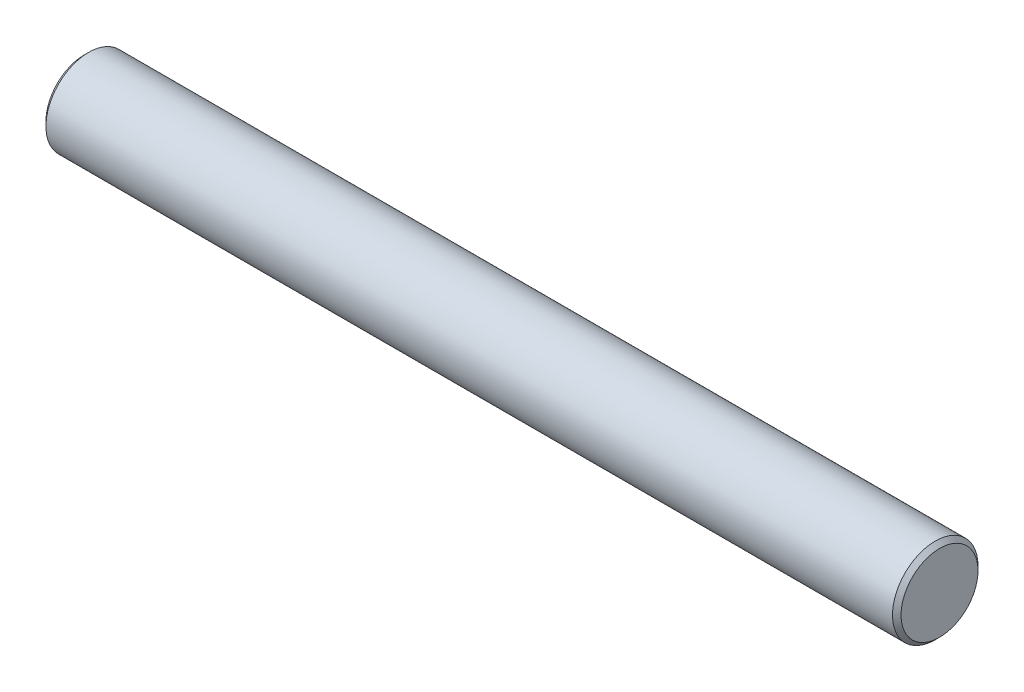
ISO-10303-21;
HEADER;
FILE_DESCRIPTION(('STEP AP214'),'2;1');
FILE_NAME('part.step','',(''),(''),'','','');
FILE_SCHEMA(('AUTOMOTIVE_DESIGN { 1 0 10303 214 1 1 1 1 }'));
ENDSEC;
DATA;
#1=APPLICATION_CONTEXT('core data for automotive mechanical design processes');
#2=APPLICATION_PROTOCOL_DEFINITION('international standard','automotive_design',2000,#1);
#3=PRODUCT_CONTEXT('',#1,'mechanical');
#4=PRODUCT('Part','Part','',(#3));
#5=PRODUCT_RELATED_PRODUCT_CATEGORY('part','',(#4));
#6=PRODUCT_DEFINITION_FORMATION('','',#4);
#7=PRODUCT_DEFINITION_CONTEXT('part definition',#1,'design');
#8=PRODUCT_DEFINITION('design','',#6,#7);
#9=PRODUCT_DEFINITION_SHAPE('','',#8);
#10=(LENGTH_UNIT() NAMED_UNIT(*) SI_UNIT(.MILLI.,.METRE.));
#11=(NAMED_UNIT(*) PLANE_ANGLE_UNIT() SI_UNIT($,.RADIAN.));
#12=(NAMED_UNIT(*) SI_UNIT($,.STERADIAN.) SOLID_ANGLE_UNIT());
#13=UNCERTAINTY_MEASURE_WITH_UNIT(LENGTH_MEASURE(1.E-05),#10,'distance_accuracy_value','');
#14=(GEOMETRIC_REPRESENTATION_CONTEXT(3) GLOBAL_UNCERTAINTY_ASSIGNED_CONTEXT((#13)) GLOBAL_UNIT_ASSIGNED_CONTEXT((#10,
#11,#12)) REPRESENTATION_CONTEXT('',''));
#15=CARTESIAN_POINT('',(0.,0.,0.));
#16=DIRECTION('',(0.,0.,1.));
#17=DIRECTION('',(1.,0.,0.));
#18=AXIS2_PLACEMENT_3D('',#15,#16,#17);
#19=CARTESIAN_POINT('',(50.,0.,0.));
#20=DIRECTION('',(-1.,0.,0.));
#21=DIRECTION('',(0.,0.,1.));
#22=AXIS2_PLACEMENT_3D('',#19,#20,#21);
#23=CYLINDRICAL_SURFACE('',#22,2.5);
#24=CARTESIAN_POINT('',(0.249999999999966,0.,0.));
#25=DIRECTION('',(1.,0.,0.));
#26=DIRECTION('',(0.,0.,-1.));
#27=AXIS2_PLACEMENT_3D('',#24,#25,#26);
#28=CIRCLE('',#27,2.5);
#29=CARTESIAN_POINT('',(0.249999999999966,0.,-2.5));
#30=VERTEX_POINT('',#29);
#31=EDGE_CURVE('E38',#30,#30,#28,.T.);
#32=ORIENTED_EDGE('',*,*,#31,.T.);
#33=EDGE_LOOP('',(#32));
#34=FACE_BOUND('',#33,.T.);
#35=CARTESIAN_POINT('',(49.75,0.,0.));
#36=DIRECTION('',(1.,0.,0.));
#37=DIRECTION('',(0.,0.,-1.));
#38=AXIS2_PLACEMENT_3D('',#35,#36,#37);
#39=CIRCLE('',#38,2.5);
#40=CARTESIAN_POINT('',(49.75,0.,-2.5));
#41=VERTEX_POINT('',#40);
#42=EDGE_CURVE('E42',#41,#41,#39,.F.);
#43=ORIENTED_EDGE('',*,*,#42,.T.);
#44=EDGE_LOOP('',(#43));
#45=FACE_BOUND('',#44,.T.);
#46=ADVANCED_FACE('F31',(#34,#45),#23,.T.);
#47=CARTESIAN_POINT('',(50.,0.,0.));
#48=DIRECTION('',(1.,0.,0.));
#49=DIRECTION('',(0.,0.,-1.));
#50=AXIS2_PLACEMENT_3D('',#47,#48,#49);
#51=PLANE('',#50);
#52=CARTESIAN_POINT('',(50.,0.,0.));
#53=DIRECTION('',(1.,0.,0.));
#54=DIRECTION('',(0.,0.,-1.));
#55=AXIS2_PLACEMENT_3D('',#52,#53,#54);
#56=CIRCLE('',#55,2.25000000000002);
#57=CARTESIAN_POINT('',(50.,0.,-2.25000000000002));
#58=VERTEX_POINT('',#57);
#59=EDGE_CURVE('E10',#58,#58,#56,.T.);
#60=ORIENTED_EDGE('',*,*,#59,.T.);
#61=EDGE_LOOP('',(#60));
#62=FACE_BOUND('',#61,.T.);
#63=ADVANCED_FACE('F62',(#62),#51,.T.);
#64=CARTESIAN_POINT('',(0.,0.,0.));
#65=DIRECTION('',(1.,0.,0.));
#66=DIRECTION('',(0.,0.,-1.));
#67=AXIS2_PLACEMENT_3D('',#64,#65,#66);
#68=PLANE('',#67);
#69=CARTESIAN_POINT('',(0.,0.,0.));
#70=DIRECTION('',(1.,0.,0.));
#71=DIRECTION('',(0.,0.,-1.));
#72=AXIS2_PLACEMENT_3D('',#69,#70,#71);
#73=CIRCLE('',#72,2.25000000000003);
#74=CARTESIAN_POINT('',(0.,0.,-2.25000000000003));
#75=VERTEX_POINT('',#74);
#76=EDGE_CURVE('E46',#75,#75,#73,.F.);
#77=ORIENTED_EDGE('',*,*,#76,.T.);
#78=EDGE_LOOP('',(#77));
#79=FACE_BOUND('',#78,.T.);
#80=ADVANCED_FACE('F52',(#79),#68,.F.);
#81=CARTESIAN_POINT('',(0.,0.,0.));
#82=DIRECTION('',(1.,0.,0.));
#83=DIRECTION('',(0.,0.,-1.));
#84=AXIS2_PLACEMENT_3D('',#81,#82,#83);
#85=CONICAL_SURFACE('',#84,2.25000000000003,0.785398163397458);
#86=ORIENTED_EDGE('',*,*,#31,.F.);
#87=EDGE_LOOP('',(#86));
#88=FACE_BOUND('',#87,.T.);
#89=ORIENTED_EDGE('',*,*,#76,.F.);
#90=EDGE_LOOP('',(#89));
#91=FACE_BOUND('',#90,.T.);
#92=ADVANCED_FACE('F54',(#88,#91),#85,.T.);
#93=CARTESIAN_POINT('',(49.75,0.,0.));
#94=DIRECTION('',(-1.,0.,0.));
#95=DIRECTION('',(0.,0.,1.));
#96=AXIS2_PLACEMENT_3D('',#93,#94,#95);
#97=CONICAL_SURFACE('',#96,2.5,0.785398163397458);
#98=ORIENTED_EDGE('',*,*,#59,.F.);
#99=EDGE_LOOP('',(#98));
#100=FACE_BOUND('',#99,.T.);
#101=ORIENTED_EDGE('',*,*,#42,.F.);
#102=EDGE_LOOP('',(#101));
#103=FACE_BOUND('',#102,.T.);
#104=ADVANCED_FACE('F33',(#100,#103),#97,.T.);
#105=CLOSED_SHELL('',(#46,#63,#80,#92,#104));
#106=MANIFOLD_SOLID_BREP('B2',#105);
#107=ADVANCED_BREP_SHAPE_REPRESENTATION('',(#18,#106),#14);
#108=SHAPE_DEFINITION_REPRESENTATION(#9,#107);
ENDSEC;
END-ISO-10303-21;
